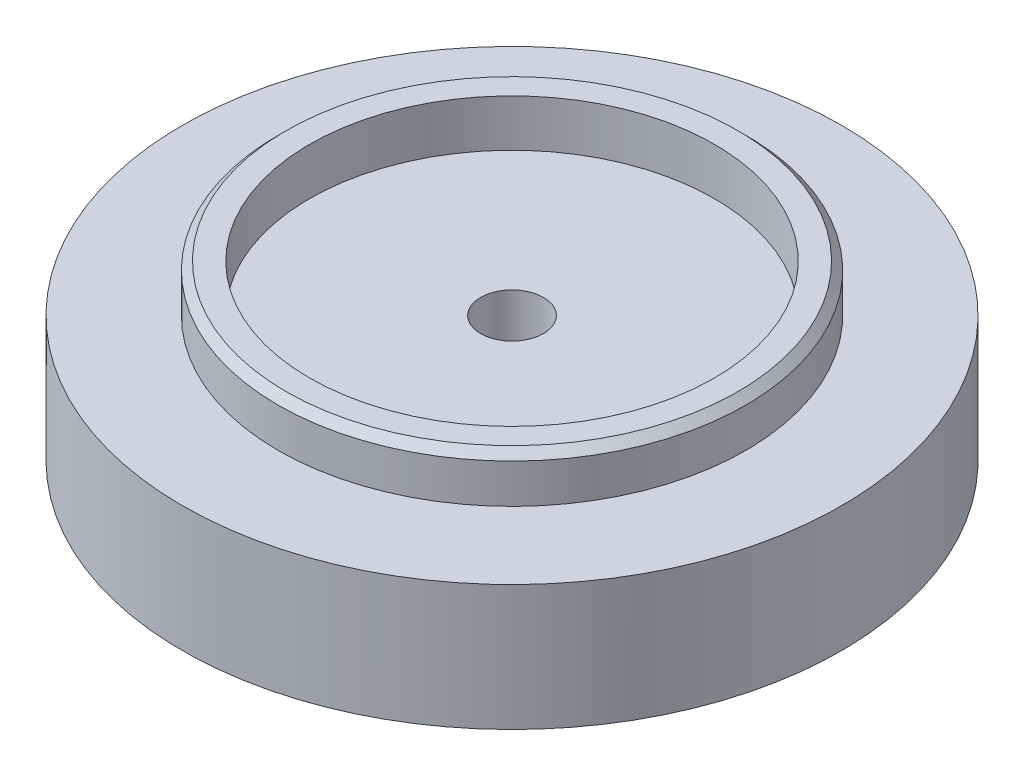
ISO-10303-21;
HEADER;
FILE_DESCRIPTION(('STEP AP214'),'2;1');
FILE_NAME('part.step','',(''),(''),'','','');
FILE_SCHEMA(('AUTOMOTIVE_DESIGN { 1 0 10303 214 1 1 1 1 }'));
ENDSEC;
DATA;
#1=APPLICATION_CONTEXT('core data for automotive mechanical design processes');
#2=APPLICATION_PROTOCOL_DEFINITION('international standard','automotive_design',2000,#1);
#3=PRODUCT_CONTEXT('',#1,'mechanical');
#4=PRODUCT('Part','Part','',(#3));
#5=PRODUCT_RELATED_PRODUCT_CATEGORY('part','',(#4));
#6=PRODUCT_DEFINITION_FORMATION('','',#4);
#7=PRODUCT_DEFINITION_CONTEXT('part definition',#1,'design');
#8=PRODUCT_DEFINITION('design','',#6,#7);
#9=PRODUCT_DEFINITION_SHAPE('','',#8);
#10=(LENGTH_UNIT() NAMED_UNIT(*) SI_UNIT(.MILLI.,.METRE.));
#11=(NAMED_UNIT(*) PLANE_ANGLE_UNIT() SI_UNIT($,.RADIAN.));
#12=(NAMED_UNIT(*) SI_UNIT($,.STERADIAN.) SOLID_ANGLE_UNIT());
#13=UNCERTAINTY_MEASURE_WITH_UNIT(LENGTH_MEASURE(1.E-05),#10,'distance_accuracy_value','');
#14=(GEOMETRIC_REPRESENTATION_CONTEXT(3) GLOBAL_UNCERTAINTY_ASSIGNED_CONTEXT((#13)) GLOBAL_UNIT_ASSIGNED_CONTEXT((#10,
#11,#12)) REPRESENTATION_CONTEXT('',''));
#15=CARTESIAN_POINT('',(0.,0.,0.));
#16=DIRECTION('',(0.,0.,1.));
#17=DIRECTION('',(1.,0.,0.));
#18=AXIS2_PLACEMENT_3D('',#15,#16,#17);
#19=CARTESIAN_POINT('',(0.,4.,0.));
#20=DIRECTION('',(0.,1.,0.));
#21=DIRECTION('',(0.,0.,1.));
#22=AXIS2_PLACEMENT_3D('',#19,#20,#21);
#23=PLANE('',#22);
#24=CARTESIAN_POINT('',(0.,4.,0.));
#25=DIRECTION('',(0.,1.,0.));
#26=DIRECTION('',(0.,0.,1.));
#27=AXIS2_PLACEMENT_3D('',#24,#25,#26);
#28=CIRCLE('',#27,2.);
#29=CARTESIAN_POINT('',(0.,4.,2.));
#30=VERTEX_POINT('',#29);
#31=EDGE_CURVE('E65',#30,#30,#28,.T.);
#32=ORIENTED_EDGE('',*,*,#31,.F.);
#33=EDGE_LOOP('',(#32));
#34=FACE_BOUND('',#33,.T.);
#35=CARTESIAN_POINT('',(0.,4.,0.));
#36=DIRECTION('',(0.,1.,0.));
#37=DIRECTION('',(0.,0.,1.));
#38=AXIS2_PLACEMENT_3D('',#35,#36,#37);
#39=CIRCLE('',#38,12.9);
#40=CARTESIAN_POINT('',(0.,4.,12.9));
#41=VERTEX_POINT('',#40);
#42=EDGE_CURVE('E59',#41,#41,#39,.F.);
#43=ORIENTED_EDGE('',*,*,#42,.F.);
#44=EDGE_LOOP('',(#43));
#45=FACE_BOUND('',#44,.T.);
#46=ADVANCED_FACE('F35',(#34,#45),#23,.T.);
#47=CARTESIAN_POINT('',(0.,4.,0.));
#48=DIRECTION('',(0.,1.,0.));
#49=DIRECTION('',(0.,0.,1.));
#50=AXIS2_PLACEMENT_3D('',#47,#48,#49);
#51=CIRCLE('',#50,14.9);
#52=CARTESIAN_POINT('',(0.,4.,14.9));
#53=VERTEX_POINT('',#52);
#54=EDGE_CURVE('E69',#53,#53,#51,.T.);
#55=ORIENTED_EDGE('',*,*,#54,.F.);
#56=EDGE_LOOP('',(#55));
#57=FACE_BOUND('',#56,.T.);
#58=CARTESIAN_POINT('',(0.,4.,0.));
#59=DIRECTION('',(0.,1.,0.));
#60=DIRECTION('',(0.,0.,1.));
#61=AXIS2_PLACEMENT_3D('',#58,#59,#60);
#62=CIRCLE('',#61,21.);
#63=CARTESIAN_POINT('',(0.,4.,21.));
#64=VERTEX_POINT('',#63);
#65=EDGE_CURVE('E62',#64,#64,#62,.T.);
#66=ORIENTED_EDGE('',*,*,#65,.T.);
#67=EDGE_LOOP('',(#66));
#68=FACE_BOUND('',#67,.T.);
#69=ADVANCED_FACE('F97',(#57,#68),#23,.T.);
#70=CARTESIAN_POINT('',(0.,4.,0.));
#71=DIRECTION('',(0.,-1.,0.));
#72=DIRECTION('',(0.,0.,-1.));
#73=AXIS2_PLACEMENT_3D('',#70,#71,#72);
#74=CYLINDRICAL_SURFACE('',#73,21.);
#75=ORIENTED_EDGE('',*,*,#65,.F.);
#76=EDGE_LOOP('',(#75));
#77=FACE_BOUND('',#76,.T.);
#78=CARTESIAN_POINT('',(0.,-4.,0.));
#79=DIRECTION('',(0.,-1.,0.));
#80=DIRECTION('',(0.,0.,-1.));
#81=AXIS2_PLACEMENT_3D('',#78,#79,#80);
#82=CIRCLE('',#81,21.);
#83=CARTESIAN_POINT('',(0.,-4.,-21.));
#84=VERTEX_POINT('',#83);
#85=EDGE_CURVE('E72',#84,#84,#82,.T.);
#86=ORIENTED_EDGE('',*,*,#85,.F.);
#87=EDGE_LOOP('',(#86));
#88=FACE_BOUND('',#87,.T.);
#89=ADVANCED_FACE('F103',(#77,#88),#74,.T.);
#90=CARTESIAN_POINT('',(0.,4.,0.));
#91=DIRECTION('',(0.,-1.,0.));
#92=DIRECTION('',(0.,0.,-1.));
#93=AXIS2_PLACEMENT_3D('',#90,#91,#92);
#94=CYLINDRICAL_SURFACE('',#93,2.);
#95=ORIENTED_EDGE('',*,*,#31,.T.);
#96=EDGE_LOOP('',(#95));
#97=FACE_BOUND('',#96,.T.);
#98=CARTESIAN_POINT('',(0.,-2.,0.));
#99=DIRECTION('',(0.,-1.,0.));
#100=DIRECTION('',(0.,0.,-1.));
#101=AXIS2_PLACEMENT_3D('',#98,#99,#100);
#102=CIRCLE('',#101,2.);
#103=CARTESIAN_POINT('',(0.,-2.,-2.));
#104=VERTEX_POINT('',#103);
#105=EDGE_CURVE('E77',#104,#104,#102,.T.);
#106=ORIENTED_EDGE('',*,*,#105,.T.);
#107=EDGE_LOOP('',(#106));
#108=FACE_BOUND('',#107,.T.);
#109=ADVANCED_FACE('F81',(#97,#108),#94,.F.);
#110=CARTESIAN_POINT('',(0.,7.,0.));
#111=DIRECTION('',(0.,-1.,0.));
#112=DIRECTION('',(0.,0.,-1.));
#113=AXIS2_PLACEMENT_3D('',#110,#111,#112);
#114=CYLINDRICAL_SURFACE('',#113,12.9);
#115=CARTESIAN_POINT('',(0.,7.,0.));
#116=DIRECTION('',(0.,1.,0.));
#117=DIRECTION('',(0.,0.,1.));
#118=AXIS2_PLACEMENT_3D('',#115,#116,#117);
#119=CIRCLE('',#118,12.9);
#120=CARTESIAN_POINT('',(0.,7.,12.9));
#121=VERTEX_POINT('',#120);
#122=EDGE_CURVE('E68',#121,#121,#119,.T.);
#123=ORIENTED_EDGE('',*,*,#122,.T.);
#124=EDGE_LOOP('',(#123));
#125=FACE_BOUND('',#124,.T.);
#126=ORIENTED_EDGE('',*,*,#42,.T.);
#127=EDGE_LOOP('',(#126));
#128=FACE_BOUND('',#127,.T.);
#129=ADVANCED_FACE('F134',(#125,#128),#114,.F.);
#130=CARTESIAN_POINT('',(0.,7.,0.));
#131=DIRECTION('',(0.,-1.,0.));
#132=DIRECTION('',(0.,0.,-1.));
#133=AXIS2_PLACEMENT_3D('',#130,#131,#132);
#134=CYLINDRICAL_SURFACE('',#133,14.9);
#135=CARTESIAN_POINT('',(0.,6.49999999999999,0.));
#136=DIRECTION('',(0.,1.,0.));
#137=DIRECTION('',(0.,0.,1.));
#138=AXIS2_PLACEMENT_3D('',#135,#136,#137);
#139=CIRCLE('',#138,14.9);
#140=CARTESIAN_POINT('',(0.,6.49999999999999,14.9));
#141=VERTEX_POINT('',#140);
#142=EDGE_CURVE('E51',#141,#141,#139,.F.);
#143=ORIENTED_EDGE('',*,*,#142,.T.);
#144=EDGE_LOOP('',(#143));
#145=FACE_BOUND('',#144,.T.);
#146=ORIENTED_EDGE('',*,*,#54,.T.);
#147=EDGE_LOOP('',(#146));
#148=FACE_BOUND('',#147,.T.);
#149=ADVANCED_FACE('F125',(#145,#148),#134,.T.);
#150=CARTESIAN_POINT('',(0.,7.,0.));
#151=DIRECTION('',(0.,1.,0.));
#152=DIRECTION('',(0.,0.,1.));
#153=AXIS2_PLACEMENT_3D('',#150,#151,#152);
#154=PLANE('',#153);
#155=CARTESIAN_POINT('',(0.,7.,0.));
#156=DIRECTION('',(0.,1.,0.));
#157=DIRECTION('',(0.,0.,1.));
#158=AXIS2_PLACEMENT_3D('',#155,#156,#157);
#159=CIRCLE('',#158,14.4);
#160=CARTESIAN_POINT('',(0.,7.,14.4));
#161=VERTEX_POINT('',#160);
#162=EDGE_CURVE('E56',#161,#161,#159,.T.);
#163=ORIENTED_EDGE('',*,*,#162,.T.);
#164=EDGE_LOOP('',(#163));
#165=FACE_BOUND('',#164,.T.);
#166=ORIENTED_EDGE('',*,*,#122,.F.);
#167=EDGE_LOOP('',(#166));
#168=FACE_BOUND('',#167,.T.);
#169=ADVANCED_FACE('F117',(#165,#168),#154,.T.);
#170=CARTESIAN_POINT('',(0.,7.,0.));
#171=DIRECTION('',(0.,-1.,0.));
#172=DIRECTION('',(0.,0.,-1.));
#173=AXIS2_PLACEMENT_3D('',#170,#171,#172);
#174=CONICAL_SURFACE('',#173,14.4,0.785398163397445);
#175=ORIENTED_EDGE('',*,*,#142,.F.);
#176=EDGE_LOOP('',(#175));
#177=FACE_BOUND('',#176,.T.);
#178=ORIENTED_EDGE('',*,*,#162,.F.);
#179=EDGE_LOOP('',(#178));
#180=FACE_BOUND('',#179,.T.);
#181=ADVANCED_FACE('F113',(#177,#180),#174,.T.);
#182=CARTESIAN_POINT('',(0.,-4.,0.));
#183=DIRECTION('',(0.,-1.,0.));
#184=DIRECTION('',(0.,0.,-1.));
#185=AXIS2_PLACEMENT_3D('',#182,#183,#184);
#186=PLANE('',#185);
#187=CARTESIAN_POINT('',(0.,-4.,0.));
#188=DIRECTION('',(0.,-1.,0.));
#189=DIRECTION('',(0.,0.,-1.));
#190=AXIS2_PLACEMENT_3D('',#187,#188,#189);
#191=CIRCLE('',#190,3.15000000000002);
#192=CARTESIAN_POINT('',(0.,-4.,-3.15000000000002));
#193=VERTEX_POINT('',#192);
#194=EDGE_CURVE('E10',#193,#193,#191,.F.);
#195=ORIENTED_EDGE('',*,*,#194,.T.);
#196=EDGE_LOOP('',(#195));
#197=FACE_BOUND('',#196,.T.);
#198=ORIENTED_EDGE('',*,*,#85,.T.);
#199=EDGE_LOOP('',(#198));
#200=FACE_BOUND('',#199,.T.);
#201=ADVANCED_FACE('F94',(#197,#200),#186,.T.);
#202=CARTESIAN_POINT('',(0.,-4.,0.));
#203=DIRECTION('',(0.,1.,0.));
#204=DIRECTION('',(0.,0.,1.));
#205=AXIS2_PLACEMENT_3D('',#202,#203,#204);
#206=CYLINDRICAL_SURFACE('',#205,2.65);
#207=CARTESIAN_POINT('',(0.,-3.49999999999998,0.));
#208=DIRECTION('',(0.,-1.,0.));
#209=DIRECTION('',(0.,0.,-1.));
#210=AXIS2_PLACEMENT_3D('',#207,#208,#209);
#211=CIRCLE('',#210,2.65);
#212=CARTESIAN_POINT('',(0.,-3.49999999999998,-2.65));
#213=VERTEX_POINT('',#212);
#214=EDGE_CURVE('E43',#213,#213,#211,.T.);
#215=ORIENTED_EDGE('',*,*,#214,.T.);
#216=EDGE_LOOP('',(#215));
#217=FACE_BOUND('',#216,.T.);
#218=CARTESIAN_POINT('',(0.,-2.,0.));
#219=DIRECTION('',(0.,-1.,0.));
#220=DIRECTION('',(0.,0.,-1.));
#221=AXIS2_PLACEMENT_3D('',#218,#219,#220);
#222=CIRCLE('',#221,2.65);
#223=CARTESIAN_POINT('',(0.,-2.,-2.65));
#224=VERTEX_POINT('',#223);
#225=EDGE_CURVE('E47',#224,#224,#222,.T.);
#226=ORIENTED_EDGE('',*,*,#225,.F.);
#227=EDGE_LOOP('',(#226));
#228=FACE_BOUND('',#227,.T.);
#229=ADVANCED_FACE('F85',(#217,#228),#206,.F.);
#230=CARTESIAN_POINT('',(0.,-2.,0.));
#231=DIRECTION('',(0.,-1.,0.));
#232=DIRECTION('',(0.,0.,-1.));
#233=AXIS2_PLACEMENT_3D('',#230,#231,#232);
#234=PLANE('',#233);
#235=ORIENTED_EDGE('',*,*,#225,.T.);
#236=EDGE_LOOP('',(#235));
#237=FACE_BOUND('',#236,.T.);
#238=ORIENTED_EDGE('',*,*,#105,.F.);
#239=EDGE_LOOP('',(#238));
#240=FACE_BOUND('',#239,.T.);
#241=ADVANCED_FACE('F83',(#237,#240),#234,.T.);
#242=CARTESIAN_POINT('',(0.,-3.49999999999998,0.));
#243=DIRECTION('',(0.,-1.,0.));
#244=DIRECTION('',(0.,0.,-1.));
#245=AXIS2_PLACEMENT_3D('',#242,#243,#244);
#246=CONICAL_SURFACE('',#245,2.65,0.785398163397453);
#247=ORIENTED_EDGE('',*,*,#194,.F.);
#248=EDGE_LOOP('',(#247));
#249=FACE_BOUND('',#248,.T.);
#250=ORIENTED_EDGE('',*,*,#214,.F.);
#251=EDGE_LOOP('',(#250));
#252=FACE_BOUND('',#251,.T.);
#253=ADVANCED_FACE('F38',(#249,#252),#246,.F.);
#254=CLOSED_SHELL('',(#46,#69,#89,#109,#129,#149,#169,#181,#201,#229,#241,#253));
#255=MANIFOLD_SOLID_BREP('B2',#254);
#256=ADVANCED_BREP_SHAPE_REPRESENTATION('',(#18,#255),#14);
#257=SHAPE_DEFINITION_REPRESENTATION(#9,#256);
ENDSEC;
END-ISO-10303-21;
